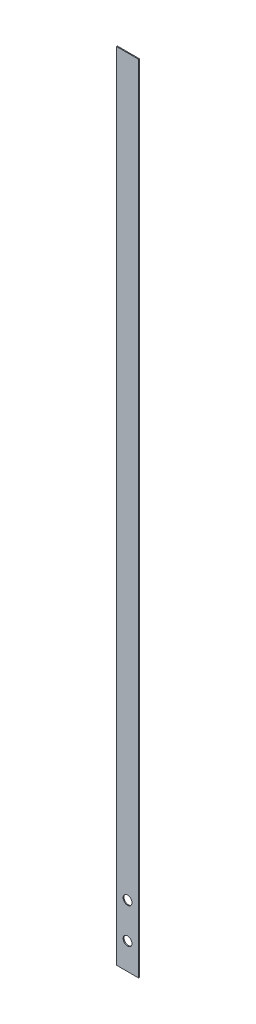
ISO-10303-21;
HEADER;
FILE_DESCRIPTION(('STEP AP214'),'2;1');
FILE_NAME('part.step','',(''),(''),'','','');
FILE_SCHEMA(('AUTOMOTIVE_DESIGN { 1 0 10303 214 1 1 1 1 }'));
ENDSEC;
DATA;
#1=APPLICATION_CONTEXT('core data for automotive mechanical design processes');
#2=APPLICATION_PROTOCOL_DEFINITION('international standard','automotive_design',2000,#1);
#3=PRODUCT_CONTEXT('',#1,'mechanical');
#4=PRODUCT('Part','Part','',(#3));
#5=PRODUCT_RELATED_PRODUCT_CATEGORY('part','',(#4));
#6=PRODUCT_DEFINITION_FORMATION('','',#4);
#7=PRODUCT_DEFINITION_CONTEXT('part definition',#1,'design');
#8=PRODUCT_DEFINITION('design','',#6,#7);
#9=PRODUCT_DEFINITION_SHAPE('','',#8);
#10=(LENGTH_UNIT() NAMED_UNIT(*) SI_UNIT(.MILLI.,.METRE.));
#11=(NAMED_UNIT(*) PLANE_ANGLE_UNIT() SI_UNIT($,.RADIAN.));
#12=(NAMED_UNIT(*) SI_UNIT($,.STERADIAN.) SOLID_ANGLE_UNIT());
#13=UNCERTAINTY_MEASURE_WITH_UNIT(LENGTH_MEASURE(1.E-05),#10,'distance_accuracy_value','');
#14=(GEOMETRIC_REPRESENTATION_CONTEXT(3) GLOBAL_UNCERTAINTY_ASSIGNED_CONTEXT((#13)) GLOBAL_UNIT_ASSIGNED_CONTEXT((#10,
#11,#12)) REPRESENTATION_CONTEXT('',''));
#15=CARTESIAN_POINT('',(0.,0.,0.));
#16=DIRECTION('',(0.,0.,1.));
#17=DIRECTION('',(1.,0.,0.));
#18=AXIS2_PLACEMENT_3D('',#15,#16,#17);
#19=CARTESIAN_POINT('',(2.50000000000001,180.,-0.1));
#20=DIRECTION('',(-1.,0.,0.));
#21=DIRECTION('',(0.,0.,1.));
#22=AXIS2_PLACEMENT_3D('',#19,#20,#21);
#23=PLANE('',#22);
#24=DIRECTION('',(0.,0.,-1.));
#25=VECTOR('',#24,1.);
#26=CARTESIAN_POINT('',(2.50000000000001,0.,-0.1));
#27=LINE('',#26,#25);
#28=CARTESIAN_POINT('',(2.50000000000001,0.,0.0999999999999985));
#29=VERTEX_POINT('',#28);
#30=CARTESIAN_POINT('',(2.50000000000001,0.,-0.1));
#31=VERTEX_POINT('',#30);
#32=EDGE_CURVE('E95',#29,#31,#27,.T.);
#33=ORIENTED_EDGE('',*,*,#32,.T.);
#34=DIRECTION('',(0.,-1.,0.));
#35=VECTOR('',#34,1.);
#36=CARTESIAN_POINT('',(2.50000000000001,180.,-0.1));
#37=LINE('',#36,#35);
#38=CARTESIAN_POINT('',(2.50000000000001,180.,-0.1));
#39=VERTEX_POINT('',#38);
#40=EDGE_CURVE('E11',#39,#31,#37,.T.);
#41=ORIENTED_EDGE('',*,*,#40,.F.);
#42=DIRECTION('',(0.,0.,-1.));
#43=VECTOR('',#42,1.);
#44=CARTESIAN_POINT('',(2.50000000000001,180.,-0.1));
#45=LINE('',#44,#43);
#46=CARTESIAN_POINT('',(2.50000000000001,180.,0.0999999999999985));
#47=VERTEX_POINT('',#46);
#48=EDGE_CURVE('E83',#47,#39,#45,.T.);
#49=ORIENTED_EDGE('',*,*,#48,.F.);
#50=DIRECTION('',(0.,-1.,0.));
#51=VECTOR('',#50,1.);
#52=CARTESIAN_POINT('',(2.50000000000001,180.,0.0999999999999985));
#53=LINE('',#52,#51);
#54=EDGE_CURVE('E91',#47,#29,#53,.T.);
#55=ORIENTED_EDGE('',*,*,#54,.T.);
#56=EDGE_LOOP('',(#33,#41,#49,#55));
#57=FACE_BOUND('',#56,.T.);
#58=ADVANCED_FACE('F32',(#57),#23,.F.);
#59=CARTESIAN_POINT('',(-2.49999999999999,180.,-0.1));
#60=DIRECTION('',(0.,0.,1.));
#61=DIRECTION('',(1.,0.,0.));
#62=AXIS2_PLACEMENT_3D('',#59,#60,#61);
#63=PLANE('',#62);
#64=CARTESIAN_POINT('',(0.,14.,-0.1));
#65=DIRECTION('',(0.,0.,-1.));
#66=DIRECTION('',(-1.,0.,0.));
#67=AXIS2_PLACEMENT_3D('',#64,#65,#66);
#68=CIRCLE('',#67,1.);
#69=CARTESIAN_POINT('',(-1.,14.,-0.1));
#70=VERTEX_POINT('',#69);
#71=EDGE_CURVE('E115',#70,#70,#68,.T.);
#72=ORIENTED_EDGE('',*,*,#71,.F.);
#73=EDGE_LOOP('',(#72));
#74=FACE_BOUND('',#73,.T.);
#75=CARTESIAN_POINT('',(0.,6.,-0.1));
#76=DIRECTION('',(0.,0.,-1.));
#77=DIRECTION('',(-1.,0.,0.));
#78=AXIS2_PLACEMENT_3D('',#75,#76,#77);
#79=CIRCLE('',#78,1.);
#80=CARTESIAN_POINT('',(-1.,6.,-0.1));
#81=VERTEX_POINT('',#80);
#82=EDGE_CURVE('E109',#81,#81,#79,.T.);
#83=ORIENTED_EDGE('',*,*,#82,.F.);
#84=EDGE_LOOP('',(#83));
#85=FACE_BOUND('',#84,.T.);
#86=DIRECTION('',(-1.,0.,0.));
#87=VECTOR('',#86,1.);
#88=CARTESIAN_POINT('',(-2.49999999999999,0.,-0.1));
#89=LINE('',#88,#87);
#90=CARTESIAN_POINT('',(-2.49999999999999,0.,-0.1));
#91=VERTEX_POINT('',#90);
#92=EDGE_CURVE('E87',#31,#91,#89,.T.);
#93=ORIENTED_EDGE('',*,*,#92,.T.);
#94=DIRECTION('',(0.,-1.,0.));
#95=VECTOR('',#94,1.);
#96=CARTESIAN_POINT('',(-2.49999999999999,180.,-0.1));
#97=LINE('',#96,#95);
#98=CARTESIAN_POINT('',(-2.49999999999999,180.,-0.1));
#99=VERTEX_POINT('',#98);
#100=EDGE_CURVE('E40',#99,#91,#97,.T.);
#101=ORIENTED_EDGE('',*,*,#100,.F.);
#102=DIRECTION('',(-1.,0.,0.));
#103=VECTOR('',#102,1.);
#104=CARTESIAN_POINT('',(-2.49999999999999,180.,-0.1));
#105=LINE('',#104,#103);
#106=EDGE_CURVE('E78',#39,#99,#105,.T.);
#107=ORIENTED_EDGE('',*,*,#106,.F.);
#108=ORIENTED_EDGE('',*,*,#40,.T.);
#109=EDGE_LOOP('',(#93,#101,#107,#108));
#110=FACE_BOUND('',#109,.T.);
#111=ADVANCED_FACE('F86',(#74,#85,#110),#63,.F.);
#112=CARTESIAN_POINT('',(-2.49999999999999,180.,-0.1));
#113=DIRECTION('',(1.,0.,0.));
#114=DIRECTION('',(0.,0.,-1.));
#115=AXIS2_PLACEMENT_3D('',#112,#113,#114);
#116=PLANE('',#115);
#117=DIRECTION('',(0.,0.,1.));
#118=VECTOR('',#117,1.);
#119=CARTESIAN_POINT('',(-2.49999999999999,0.,-0.1));
#120=LINE('',#119,#118);
#121=CARTESIAN_POINT('',(-2.49999999999999,0.,0.0999999999999985));
#122=VERTEX_POINT('',#121);
#123=EDGE_CURVE('E65',#91,#122,#120,.T.);
#124=ORIENTED_EDGE('',*,*,#123,.T.);
#125=DIRECTION('',(0.,-1.,0.));
#126=VECTOR('',#125,1.);
#127=CARTESIAN_POINT('',(-2.49999999999999,180.,0.0999999999999985));
#128=LINE('',#127,#126);
#129=CARTESIAN_POINT('',(-2.49999999999999,180.,0.0999999999999985));
#130=VERTEX_POINT('',#129);
#131=EDGE_CURVE('E88',#130,#122,#128,.T.);
#132=ORIENTED_EDGE('',*,*,#131,.F.);
#133=DIRECTION('',(0.,0.,1.));
#134=VECTOR('',#133,1.);
#135=CARTESIAN_POINT('',(-2.49999999999999,180.,-0.1));
#136=LINE('',#135,#134);
#137=EDGE_CURVE('E81',#99,#130,#136,.T.);
#138=ORIENTED_EDGE('',*,*,#137,.F.);
#139=ORIENTED_EDGE('',*,*,#100,.T.);
#140=EDGE_LOOP('',(#124,#132,#138,#139));
#141=FACE_BOUND('',#140,.T.);
#142=ADVANCED_FACE('F89',(#141),#116,.F.);
#143=CARTESIAN_POINT('',(-2.49999999999999,180.,0.0999999999999985));
#144=DIRECTION('',(0.,0.,-1.));
#145=DIRECTION('',(-1.,0.,0.));
#146=AXIS2_PLACEMENT_3D('',#143,#144,#145);
#147=PLANE('',#146);
#148=CARTESIAN_POINT('',(0.,14.,0.0999999999999985));
#149=DIRECTION('',(0.,0.,-1.));
#150=DIRECTION('',(-1.,0.,0.));
#151=AXIS2_PLACEMENT_3D('',#148,#149,#150);
#152=CIRCLE('',#151,1.);
#153=CARTESIAN_POINT('',(-1.,14.,0.0999999999999985));
#154=VERTEX_POINT('',#153);
#155=EDGE_CURVE('E112',#154,#154,#152,.T.);
#156=ORIENTED_EDGE('',*,*,#155,.T.);
#157=EDGE_LOOP('',(#156));
#158=FACE_BOUND('',#157,.T.);
#159=CARTESIAN_POINT('',(0.,6.,0.0999999999999985));
#160=DIRECTION('',(0.,0.,-1.));
#161=DIRECTION('',(-1.,0.,0.));
#162=AXIS2_PLACEMENT_3D('',#159,#160,#161);
#163=CIRCLE('',#162,1.);
#164=CARTESIAN_POINT('',(-1.,6.,0.0999999999999985));
#165=VERTEX_POINT('',#164);
#166=EDGE_CURVE('E98',#165,#165,#163,.T.);
#167=ORIENTED_EDGE('',*,*,#166,.T.);
#168=EDGE_LOOP('',(#167));
#169=FACE_BOUND('',#168,.T.);
#170=DIRECTION('',(1.,0.,0.));
#171=VECTOR('',#170,1.);
#172=CARTESIAN_POINT('',(-2.49999999999999,0.,0.0999999999999985));
#173=LINE('',#172,#171);
#174=EDGE_CURVE('E71',#122,#29,#173,.T.);
#175=ORIENTED_EDGE('',*,*,#174,.T.);
#176=ORIENTED_EDGE('',*,*,#54,.F.);
#177=DIRECTION('',(1.,0.,0.));
#178=VECTOR('',#177,1.);
#179=CARTESIAN_POINT('',(-2.49999999999999,180.,0.0999999999999985));
#180=LINE('',#179,#178);
#181=EDGE_CURVE('E48',#130,#47,#180,.T.);
#182=ORIENTED_EDGE('',*,*,#181,.F.);
#183=ORIENTED_EDGE('',*,*,#131,.T.);
#184=EDGE_LOOP('',(#175,#176,#182,#183));
#185=FACE_BOUND('',#184,.T.);
#186=ADVANCED_FACE('F103',(#158,#169,#185),#147,.F.);
#187=CARTESIAN_POINT('',(2.50000000000001,180.,0.0999999999999985));
#188=DIRECTION('',(0.,1.,0.));
#189=DIRECTION('',(0.,0.,1.));
#190=AXIS2_PLACEMENT_3D('',#187,#188,#189);
#191=PLANE('',#190);
#192=ORIENTED_EDGE('',*,*,#48,.T.);
#193=ORIENTED_EDGE('',*,*,#106,.T.);
#194=ORIENTED_EDGE('',*,*,#137,.T.);
#195=ORIENTED_EDGE('',*,*,#181,.T.);
#196=EDGE_LOOP('',(#192,#193,#194,#195));
#197=FACE_BOUND('',#196,.T.);
#198=ADVANCED_FACE('F79',(#197),#191,.T.);
#199=CARTESIAN_POINT('',(2.50000000000001,0.,0.0999999999999985));
#200=DIRECTION('',(0.,1.,0.));
#201=DIRECTION('',(0.,0.,1.));
#202=AXIS2_PLACEMENT_3D('',#199,#200,#201);
#203=PLANE('',#202);
#204=ORIENTED_EDGE('',*,*,#32,.F.);
#205=ORIENTED_EDGE('',*,*,#174,.F.);
#206=ORIENTED_EDGE('',*,*,#123,.F.);
#207=ORIENTED_EDGE('',*,*,#92,.F.);
#208=EDGE_LOOP('',(#204,#205,#206,#207));
#209=FACE_BOUND('',#208,.T.);
#210=ADVANCED_FACE('F106',(#209),#203,.F.);
#211=CARTESIAN_POINT('',(0.,6.,0.0999999999999985));
#212=DIRECTION('',(0.,0.,-1.));
#213=DIRECTION('',(-1.,0.,0.));
#214=AXIS2_PLACEMENT_3D('',#211,#212,#213);
#215=CYLINDRICAL_SURFACE('',#214,1.);
#216=ORIENTED_EDGE('',*,*,#166,.F.);
#217=EDGE_LOOP('',(#216));
#218=FACE_BOUND('',#217,.T.);
#219=ORIENTED_EDGE('',*,*,#82,.T.);
#220=EDGE_LOOP('',(#219));
#221=FACE_BOUND('',#220,.T.);
#222=ADVANCED_FACE('F126',(#218,#221),#215,.F.);
#223=CARTESIAN_POINT('',(0.,14.,0.0999999999999985));
#224=DIRECTION('',(0.,0.,-1.));
#225=DIRECTION('',(-1.,0.,0.));
#226=AXIS2_PLACEMENT_3D('',#223,#224,#225);
#227=CYLINDRICAL_SURFACE('',#226,1.);
#228=ORIENTED_EDGE('',*,*,#155,.F.);
#229=EDGE_LOOP('',(#228));
#230=FACE_BOUND('',#229,.T.);
#231=ORIENTED_EDGE('',*,*,#71,.T.);
#232=EDGE_LOOP('',(#231));
#233=FACE_BOUND('',#232,.T.);
#234=ADVANCED_FACE('F123',(#230,#233),#227,.F.);
#235=CLOSED_SHELL('',(#58,#111,#142,#186,#198,#210,#222,#234));
#236=MANIFOLD_SOLID_BREP('B2',#235);
#237=ADVANCED_BREP_SHAPE_REPRESENTATION('',(#18,#236),#14);
#238=SHAPE_DEFINITION_REPRESENTATION(#9,#237);
ENDSEC;
END-ISO-10303-21;
